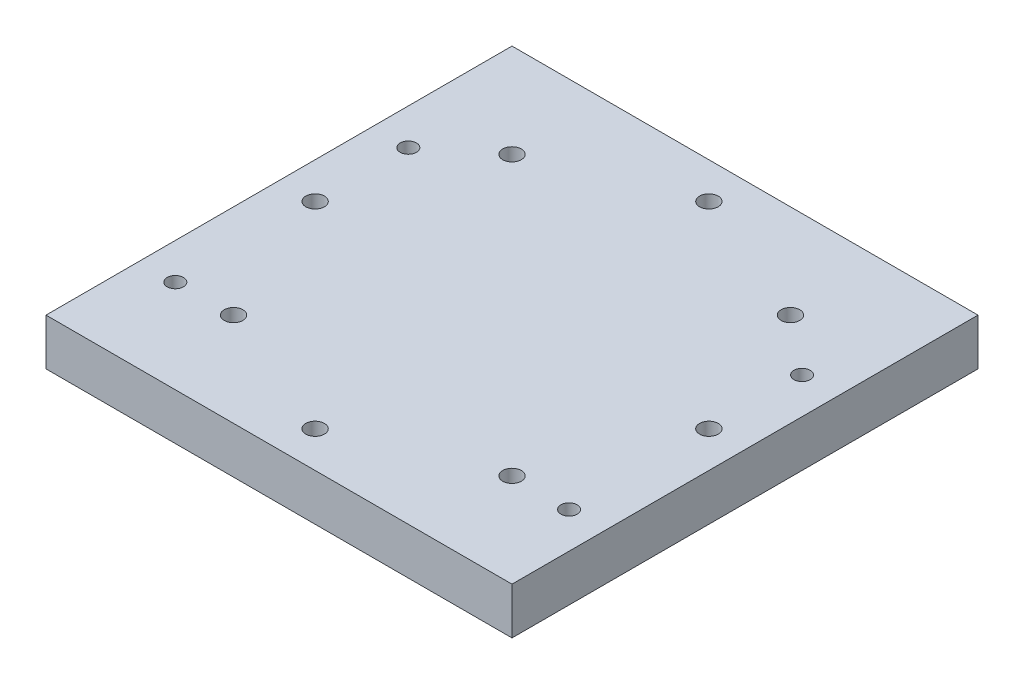
ISO-10303-21;
HEADER;
FILE_DESCRIPTION(('STEP AP214'),'2;1');
FILE_NAME('part.step','',(''),(''),'','','');
FILE_SCHEMA(('AUTOMOTIVE_DESIGN { 1 0 10303 214 1 1 1 1 }'));
ENDSEC;
DATA;
#1=APPLICATION_CONTEXT('core data for automotive mechanical design processes');
#2=APPLICATION_PROTOCOL_DEFINITION('international standard','automotive_design',2000,#1);
#3=PRODUCT_CONTEXT('',#1,'mechanical');
#4=PRODUCT('Part','Part','',(#3));
#5=PRODUCT_RELATED_PRODUCT_CATEGORY('part','',(#4));
#6=PRODUCT_DEFINITION_FORMATION('','',#4);
#7=PRODUCT_DEFINITION_CONTEXT('part definition',#1,'design');
#8=PRODUCT_DEFINITION('design','',#6,#7);
#9=PRODUCT_DEFINITION_SHAPE('','',#8);
#10=(LENGTH_UNIT() NAMED_UNIT(*) SI_UNIT(.MILLI.,.METRE.));
#11=(NAMED_UNIT(*) PLANE_ANGLE_UNIT() SI_UNIT($,.RADIAN.));
#12=(NAMED_UNIT(*) SI_UNIT($,.STERADIAN.) SOLID_ANGLE_UNIT());
#13=UNCERTAINTY_MEASURE_WITH_UNIT(LENGTH_MEASURE(1.E-05),#10,'distance_accuracy_value','');
#14=(GEOMETRIC_REPRESENTATION_CONTEXT(3) GLOBAL_UNCERTAINTY_ASSIGNED_CONTEXT((#13)) GLOBAL_UNIT_ASSIGNED_CONTEXT((#10,
#11,#12)) REPRESENTATION_CONTEXT('',''));
#15=CARTESIAN_POINT('',(0.,0.,0.));
#16=DIRECTION('',(0.,0.,1.));
#17=DIRECTION('',(1.,0.,0.));
#18=AXIS2_PLACEMENT_3D('',#15,#16,#17);
#19=CARTESIAN_POINT('',(0.,10.,0.));
#20=DIRECTION('',(0.,-1.,0.));
#21=DIRECTION('',(0.,0.,-1.));
#22=AXIS2_PLACEMENT_3D('',#19,#20,#21);
#23=PLANE('',#22);
#24=DIRECTION('',(0.,0.,1.));
#25=VECTOR('',#24,1.);
#26=CARTESIAN_POINT('',(0.,10.,0.));
#27=LINE('',#26,#25);
#28=CARTESIAN_POINT('',(0.,10.,-100.));
#29=VERTEX_POINT('',#28);
#30=CARTESIAN_POINT('',(0.,10.,0.));
#31=VERTEX_POINT('',#30);
#32=EDGE_CURVE('E89',#29,#31,#27,.T.);
#33=ORIENTED_EDGE('',*,*,#32,.T.);
#34=DIRECTION('',(1.,0.,0.));
#35=VECTOR('',#34,1.);
#36=CARTESIAN_POINT('',(0.,10.,0.));
#37=LINE('',#36,#35);
#38=CARTESIAN_POINT('',(100.,10.,0.));
#39=VERTEX_POINT('',#38);
#40=EDGE_CURVE('E84',#31,#39,#37,.T.);
#41=ORIENTED_EDGE('',*,*,#40,.T.);
#42=DIRECTION('',(0.,0.,-1.));
#43=VECTOR('',#42,1.);
#44=CARTESIAN_POINT('',(100.,10.,0.));
#45=LINE('',#44,#43);
#46=CARTESIAN_POINT('',(100.,10.,-100.));
#47=VERTEX_POINT('',#46);
#48=EDGE_CURVE('E87',#39,#47,#45,.T.);
#49=ORIENTED_EDGE('',*,*,#48,.T.);
#50=DIRECTION('',(-1.,0.,0.));
#51=VECTOR('',#50,1.);
#52=CARTESIAN_POINT('',(0.,10.,-100.));
#53=LINE('',#52,#51);
#54=EDGE_CURVE('E54',#47,#29,#53,.T.);
#55=ORIENTED_EDGE('',*,*,#54,.T.);
#56=EDGE_LOOP('',(#33,#41,#49,#55));
#57=FACE_BOUND('',#56,.T.);
#58=CARTESIAN_POINT('',(50.,10.,-92.25));
#59=DIRECTION('',(0.,1.,0.));
#60=DIRECTION('',(0.,0.,1.));
#61=AXIS2_PLACEMENT_3D('',#58,#59,#60);
#62=CIRCLE('',#61,2.00000000000001);
#63=CARTESIAN_POINT('',(50.,10.,-90.25));
#64=VERTEX_POINT('',#63);
#65=EDGE_CURVE('E104',#64,#64,#62,.T.);
#66=ORIENTED_EDGE('',*,*,#65,.F.);
#67=EDGE_LOOP('',(#66));
#68=FACE_BOUND('',#67,.T.);
#69=CARTESIAN_POINT('',(7.75000000000002,10.,-19.9999999999985));
#70=DIRECTION('',(0.,1.,0.));
#71=DIRECTION('',(0.,0.,1.));
#72=AXIS2_PLACEMENT_3D('',#69,#70,#71);
#73=CIRCLE('',#72,1.75000000000003);
#74=CARTESIAN_POINT('',(7.75000000000002,10.,-18.2499999999985));
#75=VERTEX_POINT('',#74);
#76=EDGE_CURVE('E119',#75,#75,#73,.T.);
#77=ORIENTED_EDGE('',*,*,#76,.F.);
#78=EDGE_LOOP('',(#77));
#79=FACE_BOUND('',#78,.T.);
#80=CARTESIAN_POINT('',(79.875261505132,10.,-79.8752615051324));
#81=DIRECTION('',(0.,1.,0.));
#82=DIRECTION('',(0.,0.,1.));
#83=AXIS2_PLACEMENT_3D('',#80,#81,#82);
#84=CIRCLE('',#83,2.);
#85=CARTESIAN_POINT('',(79.875261505132,10.,-77.8752615051324));
#86=VERTEX_POINT('',#85);
#87=EDGE_CURVE('E125',#86,#86,#84,.T.);
#88=ORIENTED_EDGE('',*,*,#87,.F.);
#89=EDGE_LOOP('',(#88));
#90=FACE_BOUND('',#89,.T.);
#91=CARTESIAN_POINT('',(92.2500000000008,10.,-50.));
#92=DIRECTION('',(0.,1.,0.));
#93=DIRECTION('',(0.,0.,1.));
#94=AXIS2_PLACEMENT_3D('',#91,#92,#93);
#95=CIRCLE('',#94,1.99999999999912);
#96=CARTESIAN_POINT('',(92.2500000000008,10.,-48.0000000000009));
#97=VERTEX_POINT('',#96);
#98=EDGE_CURVE('E131',#97,#97,#95,.T.);
#99=ORIENTED_EDGE('',*,*,#98,.F.);
#100=EDGE_LOOP('',(#99));
#101=FACE_BOUND('',#100,.T.);
#102=CARTESIAN_POINT('',(79.8752615051326,10.,-20.124738494868));
#103=DIRECTION('',(0.,1.,0.));
#104=DIRECTION('',(0.,0.,1.));
#105=AXIS2_PLACEMENT_3D('',#102,#103,#104);
#106=CIRCLE('',#105,1.99999999999862);
#107=CARTESIAN_POINT('',(79.8752615051326,10.,-18.1247384948694));
#108=VERTEX_POINT('',#107);
#109=EDGE_CURVE('E137',#108,#108,#106,.T.);
#110=ORIENTED_EDGE('',*,*,#109,.F.);
#111=EDGE_LOOP('',(#110));
#112=FACE_BOUND('',#111,.T.);
#113=CARTESIAN_POINT('',(50.0000000000008,10.,-7.74999999999923));
#114=DIRECTION('',(0.,1.,0.));
#115=DIRECTION('',(0.,0.,1.));
#116=AXIS2_PLACEMENT_3D('',#113,#114,#115);
#117=CIRCLE('',#116,1.99999999999852);
#118=CARTESIAN_POINT('',(50.0000000000008,10.,-5.75000000000071));
#119=VERTEX_POINT('',#118);
#120=EDGE_CURVE('E143',#119,#119,#117,.T.);
#121=ORIENTED_EDGE('',*,*,#120,.F.);
#122=EDGE_LOOP('',(#121));
#123=FACE_BOUND('',#122,.T.);
#124=CARTESIAN_POINT('',(20.1247384948684,10.,-20.1247384948684));
#125=DIRECTION('',(0.,1.,0.));
#126=DIRECTION('',(0.,0.,1.));
#127=AXIS2_PLACEMENT_3D('',#124,#125,#126);
#128=CIRCLE('',#127,1.99999999999815);
#129=CARTESIAN_POINT('',(20.1247384948684,10.,-18.1247384948702));
#130=VERTEX_POINT('',#129);
#131=EDGE_CURVE('E149',#130,#130,#128,.T.);
#132=ORIENTED_EDGE('',*,*,#131,.F.);
#133=EDGE_LOOP('',(#132));
#134=FACE_BOUND('',#133,.T.);
#135=CARTESIAN_POINT('',(7.74999999999999,10.,-49.9999999999992));
#136=DIRECTION('',(0.,1.,0.));
#137=DIRECTION('',(0.,0.,1.));
#138=AXIS2_PLACEMENT_3D('',#135,#136,#137);
#139=CIRCLE('',#138,1.99999999999965);
#140=CARTESIAN_POINT('',(7.74999999999999,10.,-47.9999999999996));
#141=VERTEX_POINT('',#140);
#142=EDGE_CURVE('E155',#141,#141,#139,.T.);
#143=ORIENTED_EDGE('',*,*,#142,.F.);
#144=EDGE_LOOP('',(#143));
#145=FACE_BOUND('',#144,.T.);
#146=CARTESIAN_POINT('',(20.1247384948691,10.,-79.8752615051311));
#147=DIRECTION('',(0.,1.,0.));
#148=DIRECTION('',(0.,0.,1.));
#149=AXIS2_PLACEMENT_3D('',#146,#147,#148);
#150=CIRCLE('',#149,2.00000000000002);
#151=CARTESIAN_POINT('',(20.1247384948691,10.,-77.8752615051311));
#152=VERTEX_POINT('',#151);
#153=EDGE_CURVE('E161',#152,#152,#150,.T.);
#154=ORIENTED_EDGE('',*,*,#153,.F.);
#155=EDGE_LOOP('',(#154));
#156=FACE_BOUND('',#155,.T.);
#157=CARTESIAN_POINT('',(7.75000000000002,10.,-70.));
#158=DIRECTION('',(0.,1.,0.));
#159=DIRECTION('',(0.,0.,-1.));
#160=AXIS2_PLACEMENT_3D('',#157,#158,#159);
#161=CIRCLE('',#160,1.75);
#162=CARTESIAN_POINT('',(7.75000000000002,10.,-71.75));
#163=VERTEX_POINT('',#162);
#164=EDGE_CURVE('E167',#163,#163,#161,.T.);
#165=ORIENTED_EDGE('',*,*,#164,.F.);
#166=EDGE_LOOP('',(#165));
#167=FACE_BOUND('',#166,.T.);
#168=CARTESIAN_POINT('',(92.25,10.,-19.9999999999985));
#169=DIRECTION('',(0.,1.,0.));
#170=DIRECTION('',(0.,0.,-1.));
#171=AXIS2_PLACEMENT_3D('',#168,#169,#170);
#172=CIRCLE('',#171,1.75);
#173=CARTESIAN_POINT('',(92.25,10.,-21.7499999999985));
#174=VERTEX_POINT('',#173);
#175=EDGE_CURVE('E173',#174,#174,#172,.T.);
#176=ORIENTED_EDGE('',*,*,#175,.F.);
#177=EDGE_LOOP('',(#176));
#178=FACE_BOUND('',#177,.T.);
#179=CARTESIAN_POINT('',(92.25,10.,-70.));
#180=DIRECTION('',(0.,1.,0.));
#181=DIRECTION('',(0.,0.,1.));
#182=AXIS2_PLACEMENT_3D('',#179,#180,#181);
#183=CIRCLE('',#182,1.75);
#184=CARTESIAN_POINT('',(92.25,10.,-68.25));
#185=VERTEX_POINT('',#184);
#186=EDGE_CURVE('E179',#185,#185,#183,.T.);
#187=ORIENTED_EDGE('',*,*,#186,.F.);
#188=EDGE_LOOP('',(#187));
#189=FACE_BOUND('',#188,.T.);
#190=ADVANCED_FACE('F37',(#57,#68,#79,#90,#101,#112,#123,#134,#145,#156,#167,#178,#189),#23,.F.);
#191=CARTESIAN_POINT('',(0.,0.,0.));
#192=DIRECTION('',(0.,-1.,0.));
#193=DIRECTION('',(0.,0.,-1.));
#194=AXIS2_PLACEMENT_3D('',#191,#192,#193);
#195=PLANE('',#194);
#196=CARTESIAN_POINT('',(92.25,0.,-19.9999999999985));
#197=DIRECTION('',(0.,1.,0.));
#198=DIRECTION('',(0.,0.,-1.));
#199=AXIS2_PLACEMENT_3D('',#196,#197,#198);
#200=CIRCLE('',#199,1.75);
#201=CARTESIAN_POINT('',(92.25,0.,-21.7499999999985));
#202=VERTEX_POINT('',#201);
#203=EDGE_CURVE('E176',#202,#202,#200,.T.);
#204=ORIENTED_EDGE('',*,*,#203,.T.);
#205=EDGE_LOOP('',(#204));
#206=FACE_BOUND('',#205,.T.);
#207=CARTESIAN_POINT('',(20.1247384948691,0.,-79.8752615051311));
#208=DIRECTION('',(0.,1.,0.));
#209=DIRECTION('',(0.,0.,1.));
#210=AXIS2_PLACEMENT_3D('',#207,#208,#209);
#211=CIRCLE('',#210,2.00000000000002);
#212=CARTESIAN_POINT('',(20.1247384948691,0.,-77.8752615051311));
#213=VERTEX_POINT('',#212);
#214=EDGE_CURVE('E164',#213,#213,#211,.T.);
#215=ORIENTED_EDGE('',*,*,#214,.T.);
#216=EDGE_LOOP('',(#215));
#217=FACE_BOUND('',#216,.T.);
#218=CARTESIAN_POINT('',(20.1247384948684,0.,-20.1247384948684));
#219=DIRECTION('',(0.,1.,0.));
#220=DIRECTION('',(0.,0.,1.));
#221=AXIS2_PLACEMENT_3D('',#218,#219,#220);
#222=CIRCLE('',#221,1.99999999999815);
#223=CARTESIAN_POINT('',(20.1247384948684,0.,-18.1247384948702));
#224=VERTEX_POINT('',#223);
#225=EDGE_CURVE('E152',#224,#224,#222,.T.);
#226=ORIENTED_EDGE('',*,*,#225,.T.);
#227=EDGE_LOOP('',(#226));
#228=FACE_BOUND('',#227,.T.);
#229=CARTESIAN_POINT('',(79.8752615051326,0.,-20.124738494868));
#230=DIRECTION('',(0.,1.,0.));
#231=DIRECTION('',(0.,0.,1.));
#232=AXIS2_PLACEMENT_3D('',#229,#230,#231);
#233=CIRCLE('',#232,1.99999999999862);
#234=CARTESIAN_POINT('',(79.8752615051326,0.,-18.1247384948694));
#235=VERTEX_POINT('',#234);
#236=EDGE_CURVE('E140',#235,#235,#233,.T.);
#237=ORIENTED_EDGE('',*,*,#236,.T.);
#238=EDGE_LOOP('',(#237));
#239=FACE_BOUND('',#238,.T.);
#240=CARTESIAN_POINT('',(79.875261505132,0.,-79.8752615051324));
#241=DIRECTION('',(0.,1.,0.));
#242=DIRECTION('',(0.,0.,1.));
#243=AXIS2_PLACEMENT_3D('',#240,#241,#242);
#244=CIRCLE('',#243,2.);
#245=CARTESIAN_POINT('',(79.875261505132,0.,-77.8752615051324));
#246=VERTEX_POINT('',#245);
#247=EDGE_CURVE('E128',#246,#246,#244,.T.);
#248=ORIENTED_EDGE('',*,*,#247,.T.);
#249=EDGE_LOOP('',(#248));
#250=FACE_BOUND('',#249,.T.);
#251=CARTESIAN_POINT('',(50.,0.,-92.25));
#252=DIRECTION('',(0.,1.,0.));
#253=DIRECTION('',(0.,0.,1.));
#254=AXIS2_PLACEMENT_3D('',#251,#252,#253);
#255=CIRCLE('',#254,2.00000000000001);
#256=CARTESIAN_POINT('',(50.,0.,-90.25));
#257=VERTEX_POINT('',#256);
#258=EDGE_CURVE('E116',#257,#257,#255,.T.);
#259=ORIENTED_EDGE('',*,*,#258,.T.);
#260=EDGE_LOOP('',(#259));
#261=FACE_BOUND('',#260,.T.);
#262=DIRECTION('',(0.,0.,1.));
#263=VECTOR('',#262,1.);
#264=CARTESIAN_POINT('',(0.,0.,0.));
#265=LINE('',#264,#263);
#266=CARTESIAN_POINT('',(0.,0.,-100.));
#267=VERTEX_POINT('',#266);
#268=CARTESIAN_POINT('',(0.,0.,0.));
#269=VERTEX_POINT('',#268);
#270=EDGE_CURVE('E101',#267,#269,#265,.T.);
#271=ORIENTED_EDGE('',*,*,#270,.F.);
#272=DIRECTION('',(-1.,0.,0.));
#273=VECTOR('',#272,1.);
#274=CARTESIAN_POINT('',(0.,0.,-100.));
#275=LINE('',#274,#273);
#276=CARTESIAN_POINT('',(100.,0.,-100.));
#277=VERTEX_POINT('',#276);
#278=EDGE_CURVE('E77',#277,#267,#275,.T.);
#279=ORIENTED_EDGE('',*,*,#278,.F.);
#280=DIRECTION('',(0.,0.,-1.));
#281=VECTOR('',#280,1.);
#282=CARTESIAN_POINT('',(100.,0.,0.));
#283=LINE('',#282,#281);
#284=CARTESIAN_POINT('',(100.,0.,0.));
#285=VERTEX_POINT('',#284);
#286=EDGE_CURVE('E71',#285,#277,#283,.T.);
#287=ORIENTED_EDGE('',*,*,#286,.F.);
#288=DIRECTION('',(1.,0.,0.));
#289=VECTOR('',#288,1.);
#290=CARTESIAN_POINT('',(0.,0.,0.));
#291=LINE('',#290,#289);
#292=EDGE_CURVE('E93',#269,#285,#291,.T.);
#293=ORIENTED_EDGE('',*,*,#292,.F.);
#294=EDGE_LOOP('',(#271,#279,#287,#293));
#295=FACE_BOUND('',#294,.T.);
#296=CARTESIAN_POINT('',(7.75000000000002,0.,-19.9999999999985));
#297=DIRECTION('',(0.,1.,0.));
#298=DIRECTION('',(0.,0.,1.));
#299=AXIS2_PLACEMENT_3D('',#296,#297,#298);
#300=CIRCLE('',#299,1.75000000000003);
#301=CARTESIAN_POINT('',(7.75000000000002,0.,-18.2499999999985));
#302=VERTEX_POINT('',#301);
#303=EDGE_CURVE('E122',#302,#302,#300,.T.);
#304=ORIENTED_EDGE('',*,*,#303,.T.);
#305=EDGE_LOOP('',(#304));
#306=FACE_BOUND('',#305,.T.);
#307=CARTESIAN_POINT('',(92.2500000000008,0.,-50.));
#308=DIRECTION('',(0.,1.,0.));
#309=DIRECTION('',(0.,0.,1.));
#310=AXIS2_PLACEMENT_3D('',#307,#308,#309);
#311=CIRCLE('',#310,1.99999999999912);
#312=CARTESIAN_POINT('',(92.2500000000008,0.,-48.0000000000009));
#313=VERTEX_POINT('',#312);
#314=EDGE_CURVE('E134',#313,#313,#311,.T.);
#315=ORIENTED_EDGE('',*,*,#314,.T.);
#316=EDGE_LOOP('',(#315));
#317=FACE_BOUND('',#316,.T.);
#318=CARTESIAN_POINT('',(50.0000000000008,0.,-7.74999999999923));
#319=DIRECTION('',(0.,1.,0.));
#320=DIRECTION('',(0.,0.,1.));
#321=AXIS2_PLACEMENT_3D('',#318,#319,#320);
#322=CIRCLE('',#321,1.99999999999852);
#323=CARTESIAN_POINT('',(50.0000000000008,0.,-5.75000000000071));
#324=VERTEX_POINT('',#323);
#325=EDGE_CURVE('E146',#324,#324,#322,.T.);
#326=ORIENTED_EDGE('',*,*,#325,.T.);
#327=EDGE_LOOP('',(#326));
#328=FACE_BOUND('',#327,.T.);
#329=CARTESIAN_POINT('',(7.74999999999999,0.,-49.9999999999992));
#330=DIRECTION('',(0.,1.,0.));
#331=DIRECTION('',(0.,0.,1.));
#332=AXIS2_PLACEMENT_3D('',#329,#330,#331);
#333=CIRCLE('',#332,1.99999999999965);
#334=CARTESIAN_POINT('',(7.74999999999999,0.,-47.9999999999996));
#335=VERTEX_POINT('',#334);
#336=EDGE_CURVE('E158',#335,#335,#333,.T.);
#337=ORIENTED_EDGE('',*,*,#336,.T.);
#338=EDGE_LOOP('',(#337));
#339=FACE_BOUND('',#338,.T.);
#340=CARTESIAN_POINT('',(7.75000000000002,0.,-70.));
#341=DIRECTION('',(0.,1.,0.));
#342=DIRECTION('',(0.,0.,-1.));
#343=AXIS2_PLACEMENT_3D('',#340,#341,#342);
#344=CIRCLE('',#343,1.75);
#345=CARTESIAN_POINT('',(7.75000000000002,0.,-71.75));
#346=VERTEX_POINT('',#345);
#347=EDGE_CURVE('E170',#346,#346,#344,.T.);
#348=ORIENTED_EDGE('',*,*,#347,.T.);
#349=EDGE_LOOP('',(#348));
#350=FACE_BOUND('',#349,.T.);
#351=CARTESIAN_POINT('',(92.25,0.,-70.));
#352=DIRECTION('',(0.,1.,0.));
#353=DIRECTION('',(0.,0.,1.));
#354=AXIS2_PLACEMENT_3D('',#351,#352,#353);
#355=CIRCLE('',#354,1.75);
#356=CARTESIAN_POINT('',(92.25,0.,-68.25));
#357=VERTEX_POINT('',#356);
#358=EDGE_CURVE('E182',#357,#357,#355,.T.);
#359=ORIENTED_EDGE('',*,*,#358,.T.);
#360=EDGE_LOOP('',(#359));
#361=FACE_BOUND('',#360,.T.);
#362=ADVANCED_FACE('F112',(#206,#217,#228,#239,#250,#261,#295,#306,#317,#328,#339,#350,#361),
#195,.T.);
#363=CARTESIAN_POINT('',(0.,10.,0.));
#364=DIRECTION('',(1.,0.,0.));
#365=DIRECTION('',(0.,0.,-1.));
#366=AXIS2_PLACEMENT_3D('',#363,#364,#365);
#367=PLANE('',#366);
#368=ORIENTED_EDGE('',*,*,#270,.T.);
#369=DIRECTION('',(0.,-1.,0.));
#370=VECTOR('',#369,1.);
#371=CARTESIAN_POINT('',(0.,10.,0.));
#372=LINE('',#371,#370);
#373=EDGE_CURVE('E11',#31,#269,#372,.T.);
#374=ORIENTED_EDGE('',*,*,#373,.F.);
#375=ORIENTED_EDGE('',*,*,#32,.F.);
#376=DIRECTION('',(0.,-1.,0.));
#377=VECTOR('',#376,1.);
#378=CARTESIAN_POINT('',(0.,10.,-100.));
#379=LINE('',#378,#377);
#380=EDGE_CURVE('E97',#29,#267,#379,.T.);
#381=ORIENTED_EDGE('',*,*,#380,.T.);
#382=EDGE_LOOP('',(#368,#374,#375,#381));
#383=FACE_BOUND('',#382,.T.);
#384=ADVANCED_FACE('F39',(#383),#367,.F.);
#385=CARTESIAN_POINT('',(0.,10.,0.));
#386=DIRECTION('',(0.,0.,-1.));
#387=DIRECTION('',(-1.,0.,0.));
#388=AXIS2_PLACEMENT_3D('',#385,#386,#387);
#389=PLANE('',#388);
#390=ORIENTED_EDGE('',*,*,#292,.T.);
#391=DIRECTION('',(0.,-1.,0.));
#392=VECTOR('',#391,1.);
#393=CARTESIAN_POINT('',(100.,10.,0.));
#394=LINE('',#393,#392);
#395=EDGE_CURVE('E46',#39,#285,#394,.T.);
#396=ORIENTED_EDGE('',*,*,#395,.F.);
#397=ORIENTED_EDGE('',*,*,#40,.F.);
#398=ORIENTED_EDGE('',*,*,#373,.T.);
#399=EDGE_LOOP('',(#390,#396,#397,#398));
#400=FACE_BOUND('',#399,.T.);
#401=ADVANCED_FACE('F92',(#400),#389,.F.);
#402=CARTESIAN_POINT('',(100.,10.,0.));
#403=DIRECTION('',(-1.,0.,0.));
#404=DIRECTION('',(0.,0.,1.));
#405=AXIS2_PLACEMENT_3D('',#402,#403,#404);
#406=PLANE('',#405);
#407=ORIENTED_EDGE('',*,*,#286,.T.);
#408=DIRECTION('',(0.,-1.,0.));
#409=VECTOR('',#408,1.);
#410=CARTESIAN_POINT('',(100.,10.,-100.));
#411=LINE('',#410,#409);
#412=EDGE_CURVE('E94',#47,#277,#411,.T.);
#413=ORIENTED_EDGE('',*,*,#412,.F.);
#414=ORIENTED_EDGE('',*,*,#48,.F.);
#415=ORIENTED_EDGE('',*,*,#395,.T.);
#416=EDGE_LOOP('',(#407,#413,#414,#415));
#417=FACE_BOUND('',#416,.T.);
#418=ADVANCED_FACE('F95',(#417),#406,.F.);
#419=CARTESIAN_POINT('',(0.,10.,-100.));
#420=DIRECTION('',(0.,0.,1.));
#421=DIRECTION('',(1.,0.,0.));
#422=AXIS2_PLACEMENT_3D('',#419,#420,#421);
#423=PLANE('',#422);
#424=ORIENTED_EDGE('',*,*,#278,.T.);
#425=ORIENTED_EDGE('',*,*,#380,.F.);
#426=ORIENTED_EDGE('',*,*,#54,.F.);
#427=ORIENTED_EDGE('',*,*,#412,.T.);
#428=EDGE_LOOP('',(#424,#425,#426,#427));
#429=FACE_BOUND('',#428,.T.);
#430=ADVANCED_FACE('F109',(#429),#423,.F.);
#431=CARTESIAN_POINT('',(50.,10.,-92.25));
#432=DIRECTION('',(0.,-1.,0.));
#433=DIRECTION('',(0.,0.,-1.));
#434=AXIS2_PLACEMENT_3D('',#431,#432,#433);
#435=CYLINDRICAL_SURFACE('',#434,2.00000000000001);
#436=ORIENTED_EDGE('',*,*,#65,.T.);
#437=EDGE_LOOP('',(#436));
#438=FACE_BOUND('',#437,.T.);
#439=ORIENTED_EDGE('',*,*,#258,.F.);
#440=EDGE_LOOP('',(#439));
#441=FACE_BOUND('',#440,.T.);
#442=ADVANCED_FACE('F199',(#438,#441),#435,.F.);
#443=CARTESIAN_POINT('',(7.75000000000002,10.,-19.9999999999985));
#444=DIRECTION('',(0.,-1.,0.));
#445=DIRECTION('',(0.,0.,-1.));
#446=AXIS2_PLACEMENT_3D('',#443,#444,#445);
#447=CYLINDRICAL_SURFACE('',#446,1.75000000000003);
#448=ORIENTED_EDGE('',*,*,#76,.T.);
#449=EDGE_LOOP('',(#448));
#450=FACE_BOUND('',#449,.T.);
#451=ORIENTED_EDGE('',*,*,#303,.F.);
#452=EDGE_LOOP('',(#451));
#453=FACE_BOUND('',#452,.T.);
#454=ADVANCED_FACE('F253',(#450,#453),#447,.F.);
#455=CARTESIAN_POINT('',(79.875261505132,10.,-79.8752615051324));
#456=DIRECTION('',(0.,-1.,0.));
#457=DIRECTION('',(0.,0.,-1.));
#458=AXIS2_PLACEMENT_3D('',#455,#456,#457);
#459=CYLINDRICAL_SURFACE('',#458,2.);
#460=ORIENTED_EDGE('',*,*,#87,.T.);
#461=EDGE_LOOP('',(#460));
#462=FACE_BOUND('',#461,.T.);
#463=ORIENTED_EDGE('',*,*,#247,.F.);
#464=EDGE_LOOP('',(#463));
#465=FACE_BOUND('',#464,.T.);
#466=ADVANCED_FACE('F262',(#462,#465),#459,.F.);
#467=CARTESIAN_POINT('',(92.2500000000008,10.,-50.));
#468=DIRECTION('',(0.,-1.,0.));
#469=DIRECTION('',(0.,0.,-1.));
#470=AXIS2_PLACEMENT_3D('',#467,#468,#469);
#471=CYLINDRICAL_SURFACE('',#470,1.99999999999912);
#472=ORIENTED_EDGE('',*,*,#98,.T.);
#473=EDGE_LOOP('',(#472));
#474=FACE_BOUND('',#473,.T.);
#475=ORIENTED_EDGE('',*,*,#314,.F.);
#476=EDGE_LOOP('',(#475));
#477=FACE_BOUND('',#476,.T.);
#478=ADVANCED_FACE('F271',(#474,#477),#471,.F.);
#479=CARTESIAN_POINT('',(79.8752615051326,10.,-20.124738494868));
#480=DIRECTION('',(0.,-1.,0.));
#481=DIRECTION('',(0.,0.,-1.));
#482=AXIS2_PLACEMENT_3D('',#479,#480,#481);
#483=CYLINDRICAL_SURFACE('',#482,1.99999999999862);
#484=ORIENTED_EDGE('',*,*,#109,.T.);
#485=EDGE_LOOP('',(#484));
#486=FACE_BOUND('',#485,.T.);
#487=ORIENTED_EDGE('',*,*,#236,.F.);
#488=EDGE_LOOP('',(#487));
#489=FACE_BOUND('',#488,.T.);
#490=ADVANCED_FACE('F281',(#486,#489),#483,.F.);
#491=CARTESIAN_POINT('',(50.0000000000008,10.,-7.74999999999923));
#492=DIRECTION('',(0.,-1.,0.));
#493=DIRECTION('',(0.,0.,-1.));
#494=AXIS2_PLACEMENT_3D('',#491,#492,#493);
#495=CYLINDRICAL_SURFACE('',#494,1.99999999999852);
#496=ORIENTED_EDGE('',*,*,#120,.T.);
#497=EDGE_LOOP('',(#496));
#498=FACE_BOUND('',#497,.T.);
#499=ORIENTED_EDGE('',*,*,#325,.F.);
#500=EDGE_LOOP('',(#499));
#501=FACE_BOUND('',#500,.T.);
#502=ADVANCED_FACE('F291',(#498,#501),#495,.F.);
#503=CARTESIAN_POINT('',(20.1247384948684,10.,-20.1247384948684));
#504=DIRECTION('',(0.,-1.,0.));
#505=DIRECTION('',(0.,0.,-1.));
#506=AXIS2_PLACEMENT_3D('',#503,#504,#505);
#507=CYLINDRICAL_SURFACE('',#506,1.99999999999815);
#508=ORIENTED_EDGE('',*,*,#131,.T.);
#509=EDGE_LOOP('',(#508));
#510=FACE_BOUND('',#509,.T.);
#511=ORIENTED_EDGE('',*,*,#225,.F.);
#512=EDGE_LOOP('',(#511));
#513=FACE_BOUND('',#512,.T.);
#514=ADVANCED_FACE('F301',(#510,#513),#507,.F.);
#515=CARTESIAN_POINT('',(7.74999999999999,10.,-49.9999999999992));
#516=DIRECTION('',(0.,-1.,0.));
#517=DIRECTION('',(0.,0.,-1.));
#518=AXIS2_PLACEMENT_3D('',#515,#516,#517);
#519=CYLINDRICAL_SURFACE('',#518,1.99999999999965);
#520=ORIENTED_EDGE('',*,*,#142,.T.);
#521=EDGE_LOOP('',(#520));
#522=FACE_BOUND('',#521,.T.);
#523=ORIENTED_EDGE('',*,*,#336,.F.);
#524=EDGE_LOOP('',(#523));
#525=FACE_BOUND('',#524,.T.);
#526=ADVANCED_FACE('F311',(#522,#525),#519,.F.);
#527=CARTESIAN_POINT('',(20.1247384948691,10.,-79.8752615051311));
#528=DIRECTION('',(0.,-1.,0.));
#529=DIRECTION('',(0.,0.,-1.));
#530=AXIS2_PLACEMENT_3D('',#527,#528,#529);
#531=CYLINDRICAL_SURFACE('',#530,2.00000000000002);
#532=ORIENTED_EDGE('',*,*,#153,.T.);
#533=EDGE_LOOP('',(#532));
#534=FACE_BOUND('',#533,.T.);
#535=ORIENTED_EDGE('',*,*,#214,.F.);
#536=EDGE_LOOP('',(#535));
#537=FACE_BOUND('',#536,.T.);
#538=ADVANCED_FACE('F321',(#534,#537),#531,.F.);
#539=CARTESIAN_POINT('',(7.75000000000002,10.,-70.));
#540=DIRECTION('',(0.,-1.,0.));
#541=DIRECTION('',(0.,0.,-1.));
#542=AXIS2_PLACEMENT_3D('',#539,#540,#541);
#543=CYLINDRICAL_SURFACE('',#542,1.75);
#544=ORIENTED_EDGE('',*,*,#164,.T.);
#545=EDGE_LOOP('',(#544));
#546=FACE_BOUND('',#545,.T.);
#547=ORIENTED_EDGE('',*,*,#347,.F.);
#548=EDGE_LOOP('',(#547));
#549=FACE_BOUND('',#548,.T.);
#550=ADVANCED_FACE('F331',(#546,#549),#543,.F.);
#551=CARTESIAN_POINT('',(92.25,10.,-19.9999999999985));
#552=DIRECTION('',(0.,-1.,0.));
#553=DIRECTION('',(0.,0.,-1.));
#554=AXIS2_PLACEMENT_3D('',#551,#552,#553);
#555=CYLINDRICAL_SURFACE('',#554,1.75);
#556=ORIENTED_EDGE('',*,*,#175,.T.);
#557=EDGE_LOOP('',(#556));
#558=FACE_BOUND('',#557,.T.);
#559=ORIENTED_EDGE('',*,*,#203,.F.);
#560=EDGE_LOOP('',(#559));
#561=FACE_BOUND('',#560,.T.);
#562=ADVANCED_FACE('F341',(#558,#561),#555,.F.);
#563=CARTESIAN_POINT('',(92.25,10.,-70.));
#564=DIRECTION('',(0.,-1.,0.));
#565=DIRECTION('',(0.,0.,-1.));
#566=AXIS2_PLACEMENT_3D('',#563,#564,#565);
#567=CYLINDRICAL_SURFACE('',#566,1.75);
#568=ORIENTED_EDGE('',*,*,#186,.T.);
#569=EDGE_LOOP('',(#568));
#570=FACE_BOUND('',#569,.T.);
#571=ORIENTED_EDGE('',*,*,#358,.F.);
#572=EDGE_LOOP('',(#571));
#573=FACE_BOUND('',#572,.T.);
#574=ADVANCED_FACE('F188',(#570,#573),#567,.F.);
#575=CLOSED_SHELL('',(#190,#362,#384,#401,#418,#430,#442,#454,#466,#478,#490,#502,#514,#526,
#538,#550,#562,#574));
#576=MANIFOLD_SOLID_BREP('B2',#575);
#577=ADVANCED_BREP_SHAPE_REPRESENTATION('',(#18,#576),#14);
#578=SHAPE_DEFINITION_REPRESENTATION(#9,#577);
ENDSEC;
END-ISO-10303-21;
